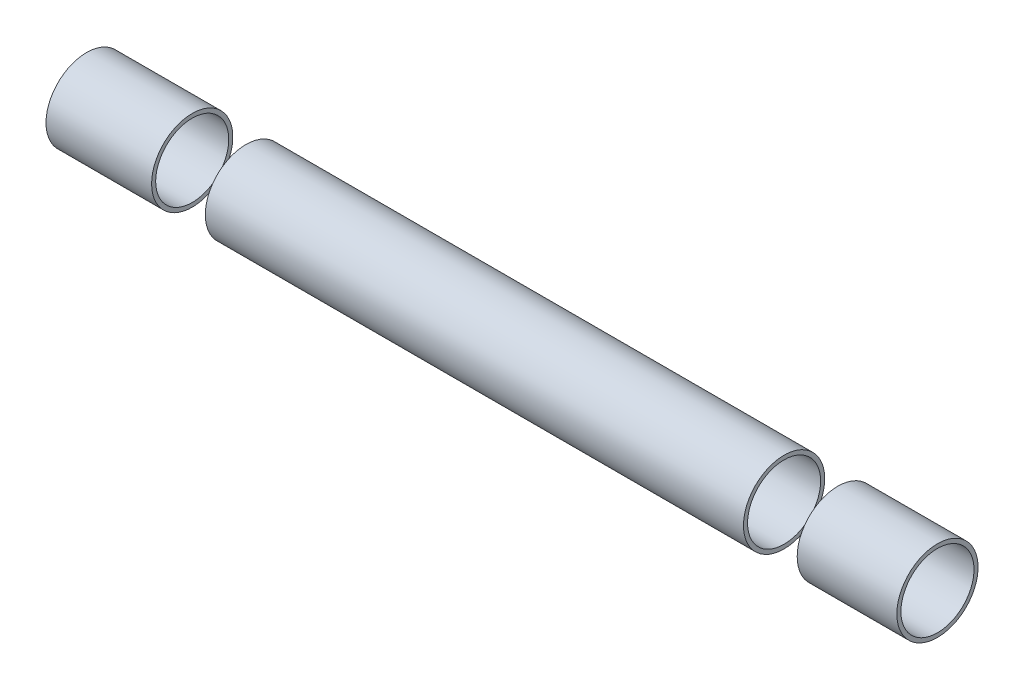
ISO-10303-21;
HEADER;
FILE_DESCRIPTION(('STEP AP214'),'2;1');
FILE_NAME('part.step','',(''),(''),'','','');
FILE_SCHEMA(('AUTOMOTIVE_DESIGN { 1 0 10303 214 1 1 1 1 }'));
ENDSEC;
DATA;
#1=APPLICATION_CONTEXT('core data for automotive mechanical design processes');
#2=APPLICATION_PROTOCOL_DEFINITION('international standard','automotive_design',2000,#1);
#3=PRODUCT_CONTEXT('',#1,'mechanical');
#4=PRODUCT('Part','Part','',(#3));
#5=PRODUCT_RELATED_PRODUCT_CATEGORY('part','',(#4));
#6=PRODUCT_DEFINITION_FORMATION('','',#4);
#7=PRODUCT_DEFINITION_CONTEXT('part definition',#1,'design');
#8=PRODUCT_DEFINITION('design','',#6,#7);
#9=PRODUCT_DEFINITION_SHAPE('','',#8);
#10=(LENGTH_UNIT() NAMED_UNIT(*) SI_UNIT(.MILLI.,.METRE.));
#11=(NAMED_UNIT(*) PLANE_ANGLE_UNIT() SI_UNIT($,.RADIAN.));
#12=(NAMED_UNIT(*) SI_UNIT($,.STERADIAN.) SOLID_ANGLE_UNIT());
#13=UNCERTAINTY_MEASURE_WITH_UNIT(LENGTH_MEASURE(1.E-05),#10,'distance_accuracy_value','');
#14=(GEOMETRIC_REPRESENTATION_CONTEXT(3) GLOBAL_UNCERTAINTY_ASSIGNED_CONTEXT((#13)) GLOBAL_UNIT_ASSIGNED_CONTEXT((#10,
#11,#12)) REPRESENTATION_CONTEXT('',''));
#15=CARTESIAN_POINT('',(0.,0.,0.));
#16=DIRECTION('',(0.,0.,1.));
#17=DIRECTION('',(1.,0.,0.));
#18=AXIS2_PLACEMENT_3D('',#15,#16,#17);
#19=CARTESIAN_POINT('',(167.4495,0.,0.));
#20=DIRECTION('',(-1.,0.,0.));
#21=DIRECTION('',(0.,0.,1.));
#22=AXIS2_PLACEMENT_3D('',#19,#20,#21);
#23=CYLINDRICAL_SURFACE('',#22,14.2875);
#24=CARTESIAN_POINT('',(-105.17450009,0.,0.));
#25=DIRECTION('',(1.,0.,0.));
#26=DIRECTION('',(0.,1.,0.));
#27=AXIS2_PLACEMENT_3D('',#24,#25,#26);
#28=CIRCLE('',#27,14.2875);
#29=CARTESIAN_POINT('',(-105.17450009,14.2875,0.));
#30=VERTEX_POINT('',#29);
#31=EDGE_CURVE('E62',#30,#30,#28,.T.);
#32=ORIENTED_EDGE('',*,*,#31,.F.);
#33=EDGE_LOOP('',(#32));
#34=FACE_BOUND('',#33,.T.);
#35=CARTESIAN_POINT('',(105.17450009,0.,0.));
#36=DIRECTION('',(-1.,0.,0.));
#37=DIRECTION('',(0.,-1.,0.));
#38=AXIS2_PLACEMENT_3D('',#35,#36,#37);
#39=CIRCLE('',#38,14.2875);
#40=CARTESIAN_POINT('',(105.17450009,-14.2875,0.));
#41=VERTEX_POINT('',#40);
#42=EDGE_CURVE('E64',#41,#41,#39,.T.);
#43=ORIENTED_EDGE('',*,*,#42,.F.);
#44=EDGE_LOOP('',(#43));
#45=FACE_BOUND('',#44,.T.);
#46=ADVANCED_FACE('F52',(#34,#45),#23,.F.);
#47=CARTESIAN_POINT('',(105.17450009,-15.875,-15.875));
#48=DIRECTION('',(-1.,0.,0.));
#49=DIRECTION('',(0.,-1.,0.));
#50=AXIS2_PLACEMENT_3D('',#47,#48,#49);
#51=PLANE('',#50);
#52=ORIENTED_EDGE('',*,*,#42,.T.);
#53=EDGE_LOOP('',(#52));
#54=FACE_BOUND('',#53,.T.);
#55=CARTESIAN_POINT('',(105.17450009,0.,0.));
#56=DIRECTION('',(-1.,0.,0.));
#57=DIRECTION('',(0.,-1.,0.));
#58=AXIS2_PLACEMENT_3D('',#55,#56,#57);
#59=CIRCLE('',#58,15.875);
#60=CARTESIAN_POINT('',(105.17450009,-15.875,0.));
#61=VERTEX_POINT('',#60);
#62=EDGE_CURVE('E55',#61,#61,#59,.T.);
#63=ORIENTED_EDGE('',*,*,#62,.F.);
#64=EDGE_LOOP('',(#63));
#65=FACE_BOUND('',#64,.T.);
#66=ADVANCED_FACE('F75',(#54,#65),#51,.F.);
#67=CARTESIAN_POINT('',(-105.17450009,-15.875,-15.875));
#68=DIRECTION('',(1.,0.,0.));
#69=DIRECTION('',(0.,1.,0.));
#70=AXIS2_PLACEMENT_3D('',#67,#68,#69);
#71=PLANE('',#70);
#72=ORIENTED_EDGE('',*,*,#31,.T.);
#73=EDGE_LOOP('',(#72));
#74=FACE_BOUND('',#73,.T.);
#75=CARTESIAN_POINT('',(-105.17450009,0.,0.));
#76=DIRECTION('',(1.,0.,0.));
#77=DIRECTION('',(0.,1.,0.));
#78=AXIS2_PLACEMENT_3D('',#75,#76,#77);
#79=CIRCLE('',#78,15.875);
#80=CARTESIAN_POINT('',(-105.17450009,15.875,0.));
#81=VERTEX_POINT('',#80);
#82=EDGE_CURVE('E12',#81,#81,#79,.T.);
#83=ORIENTED_EDGE('',*,*,#82,.F.);
#84=EDGE_LOOP('',(#83));
#85=FACE_BOUND('',#84,.T.);
#86=ADVANCED_FACE('F70',(#74,#85),#71,.F.);
#87=CARTESIAN_POINT('',(167.4495,0.,0.));
#88=DIRECTION('',(-1.,0.,0.));
#89=DIRECTION('',(0.,0.,1.));
#90=AXIS2_PLACEMENT_3D('',#87,#88,#89);
#91=CYLINDRICAL_SURFACE('',#90,15.875);
#92=ORIENTED_EDGE('',*,*,#62,.T.);
#93=EDGE_LOOP('',(#92));
#94=FACE_BOUND('',#93,.T.);
#95=ORIENTED_EDGE('',*,*,#82,.T.);
#96=EDGE_LOOP('',(#95));
#97=FACE_BOUND('',#96,.T.);
#98=ADVANCED_FACE('F83',(#94,#97),#91,.T.);
#99=CLOSED_SHELL('',(#46,#66,#86,#98));
#100=MANIFOLD_SOLID_BREP('B2',#99);
#101=CARTESIAN_POINT('',(167.4495,0.,0.));
#102=DIRECTION('',(-1.,0.,0.));
#103=DIRECTION('',(0.,0.,1.));
#104=AXIS2_PLACEMENT_3D('',#101,#102,#103);
#105=CYLINDRICAL_SURFACE('',#104,14.2875);
#106=CARTESIAN_POINT('',(165.1254,0.,0.));
#107=DIRECTION('',(-1.,0.,0.));
#108=DIRECTION('',(0.,0.,1.));
#109=AXIS2_PLACEMENT_3D('',#106,#107,#108);
#110=CIRCLE('',#109,14.2875);
#111=CARTESIAN_POINT('',(165.1254,0.,14.2875));
#112=VERTEX_POINT('',#111);
#113=EDGE_CURVE('E140',#112,#112,#110,.T.);
#114=ORIENTED_EDGE('',*,*,#113,.F.);
#115=EDGE_LOOP('',(#114));
#116=FACE_BOUND('',#115,.T.);
#117=CARTESIAN_POINT('',(126.1745,0.,0.));
#118=DIRECTION('',(1.,0.,0.));
#119=DIRECTION('',(0.,0.,-1.));
#120=AXIS2_PLACEMENT_3D('',#117,#118,#119);
#121=CIRCLE('',#120,14.2875);
#122=CARTESIAN_POINT('',(126.1745,0.,-14.2875));
#123=VERTEX_POINT('',#122);
#124=EDGE_CURVE('E144',#123,#123,#121,.T.);
#125=ORIENTED_EDGE('',*,*,#124,.F.);
#126=EDGE_LOOP('',(#125));
#127=FACE_BOUND('',#126,.T.);
#128=ADVANCED_FACE('F129',(#116,#127),#105,.F.);
#129=CARTESIAN_POINT('',(126.1745,-15.875,-15.875));
#130=DIRECTION('',(1.,0.,0.));
#131=DIRECTION('',(0.,0.,-1.));
#132=AXIS2_PLACEMENT_3D('',#129,#130,#131);
#133=PLANE('',#132);
#134=ORIENTED_EDGE('',*,*,#124,.T.);
#135=EDGE_LOOP('',(#134));
#136=FACE_BOUND('',#135,.T.);
#137=CARTESIAN_POINT('',(126.1745,0.,0.));
#138=DIRECTION('',(1.,0.,0.));
#139=DIRECTION('',(0.,0.,-1.));
#140=AXIS2_PLACEMENT_3D('',#137,#138,#139);
#141=CIRCLE('',#140,15.875);
#142=CARTESIAN_POINT('',(126.1745,0.,-15.875));
#143=VERTEX_POINT('',#142);
#144=EDGE_CURVE('E51',#143,#143,#141,.T.);
#145=ORIENTED_EDGE('',*,*,#144,.F.);
#146=EDGE_LOOP('',(#145));
#147=FACE_BOUND('',#146,.T.);
#148=ADVANCED_FACE('F150',(#136,#147),#133,.F.);
#149=CARTESIAN_POINT('',(165.1254,-15.875,-15.875));
#150=DIRECTION('',(-1.,0.,0.));
#151=DIRECTION('',(0.,0.,1.));
#152=AXIS2_PLACEMENT_3D('',#149,#150,#151);
#153=PLANE('',#152);
#154=ORIENTED_EDGE('',*,*,#113,.T.);
#155=EDGE_LOOP('',(#154));
#156=FACE_BOUND('',#155,.T.);
#157=CARTESIAN_POINT('',(165.1254,0.,0.));
#158=DIRECTION('',(-1.,0.,0.));
#159=DIRECTION('',(0.,0.,1.));
#160=AXIS2_PLACEMENT_3D('',#157,#158,#159);
#161=CIRCLE('',#160,15.875);
#162=CARTESIAN_POINT('',(165.1254,0.,15.875));
#163=VERTEX_POINT('',#162);
#164=EDGE_CURVE('E136',#163,#163,#161,.T.);
#165=ORIENTED_EDGE('',*,*,#164,.F.);
#166=EDGE_LOOP('',(#165));
#167=FACE_BOUND('',#166,.T.);
#168=ADVANCED_FACE('F158',(#156,#167),#153,.F.);
#169=CARTESIAN_POINT('',(167.4495,0.,0.));
#170=DIRECTION('',(-1.,0.,0.));
#171=DIRECTION('',(0.,0.,1.));
#172=AXIS2_PLACEMENT_3D('',#169,#170,#171);
#173=CYLINDRICAL_SURFACE('',#172,15.875);
#174=ORIENTED_EDGE('',*,*,#164,.T.);
#175=EDGE_LOOP('',(#174));
#176=FACE_BOUND('',#175,.T.);
#177=ORIENTED_EDGE('',*,*,#144,.T.);
#178=EDGE_LOOP('',(#177));
#179=FACE_BOUND('',#178,.T.);
#180=ADVANCED_FACE('F131',(#176,#179),#173,.T.);
#181=CLOSED_SHELL('',(#128,#148,#168,#180));
#182=MANIFOLD_SOLID_BREP('B7',#181);
#183=CARTESIAN_POINT('',(167.4495,0.,0.));
#184=DIRECTION('',(-1.,0.,0.));
#185=DIRECTION('',(0.,0.,1.));
#186=AXIS2_PLACEMENT_3D('',#183,#184,#185);
#187=CYLINDRICAL_SURFACE('',#186,15.875);
#188=CARTESIAN_POINT('',(-126.1745,0.,0.));
#189=DIRECTION('',(-1.,0.,0.));
#190=DIRECTION('',(0.,0.,1.));
#191=AXIS2_PLACEMENT_3D('',#188,#189,#190);
#192=CIRCLE('',#191,15.875);
#193=CARTESIAN_POINT('',(-126.1745,0.,15.875));
#194=VERTEX_POINT('',#193);
#195=EDGE_CURVE('E210',#194,#194,#192,.T.);
#196=ORIENTED_EDGE('',*,*,#195,.T.);
#197=EDGE_LOOP('',(#196));
#198=FACE_BOUND('',#197,.T.);
#199=CARTESIAN_POINT('',(-167.4495,0.,0.));
#200=DIRECTION('',(1.,0.,0.));
#201=DIRECTION('',(0.,0.,-1.));
#202=AXIS2_PLACEMENT_3D('',#199,#200,#201);
#203=CIRCLE('',#202,15.875);
#204=CARTESIAN_POINT('',(-167.4495,0.,-15.875));
#205=VERTEX_POINT('',#204);
#206=EDGE_CURVE('E128',#205,#205,#203,.T.);
#207=ORIENTED_EDGE('',*,*,#206,.T.);
#208=EDGE_LOOP('',(#207));
#209=FACE_BOUND('',#208,.T.);
#210=ADVANCED_FACE('F199',(#198,#209),#187,.T.);
#211=CARTESIAN_POINT('',(-167.4495,0.,0.));
#212=DIRECTION('',(1.,0.,0.));
#213=DIRECTION('',(0.,0.,-1.));
#214=AXIS2_PLACEMENT_3D('',#211,#212,#213);
#215=PLANE('',#214);
#216=ORIENTED_EDGE('',*,*,#206,.F.);
#217=EDGE_LOOP('',(#216));
#218=FACE_BOUND('',#217,.T.);
#219=CARTESIAN_POINT('',(-167.4495,0.,0.));
#220=DIRECTION('',(1.,0.,0.));
#221=DIRECTION('',(0.,0.,-1.));
#222=AXIS2_PLACEMENT_3D('',#219,#220,#221);
#223=CIRCLE('',#222,14.2875);
#224=CARTESIAN_POINT('',(-167.4495,0.,-14.2875));
#225=VERTEX_POINT('',#224);
#226=EDGE_CURVE('E206',#225,#225,#223,.T.);
#227=ORIENTED_EDGE('',*,*,#226,.T.);
#228=EDGE_LOOP('',(#227));
#229=FACE_BOUND('',#228,.T.);
#230=ADVANCED_FACE('F225',(#218,#229),#215,.F.);
#231=CARTESIAN_POINT('',(167.4495,0.,0.));
#232=DIRECTION('',(-1.,0.,0.));
#233=DIRECTION('',(0.,0.,1.));
#234=AXIS2_PLACEMENT_3D('',#231,#232,#233);
#235=CYLINDRICAL_SURFACE('',#234,14.2875);
#236=CARTESIAN_POINT('',(-126.1745,0.,0.));
#237=DIRECTION('',(-1.,0.,0.));
#238=DIRECTION('',(0.,0.,1.));
#239=AXIS2_PLACEMENT_3D('',#236,#237,#238);
#240=CIRCLE('',#239,14.2875);
#241=CARTESIAN_POINT('',(-126.1745,0.,14.2875));
#242=VERTEX_POINT('',#241);
#243=EDGE_CURVE('E202',#242,#242,#240,.T.);
#244=ORIENTED_EDGE('',*,*,#243,.F.);
#245=EDGE_LOOP('',(#244));
#246=FACE_BOUND('',#245,.T.);
#247=ORIENTED_EDGE('',*,*,#226,.F.);
#248=EDGE_LOOP('',(#247));
#249=FACE_BOUND('',#248,.T.);
#250=ADVANCED_FACE('F222',(#246,#249),#235,.F.);
#251=CARTESIAN_POINT('',(-126.1745,-15.875,-15.875));
#252=DIRECTION('',(-1.,0.,0.));
#253=DIRECTION('',(0.,0.,1.));
#254=AXIS2_PLACEMENT_3D('',#251,#252,#253);
#255=PLANE('',#254);
#256=ORIENTED_EDGE('',*,*,#243,.T.);
#257=EDGE_LOOP('',(#256));
#258=FACE_BOUND('',#257,.T.);
#259=ORIENTED_EDGE('',*,*,#195,.F.);
#260=EDGE_LOOP('',(#259));
#261=FACE_BOUND('',#260,.T.);
#262=ADVANCED_FACE('F219',(#258,#261),#255,.F.);
#263=CLOSED_SHELL('',(#210,#230,#250,#262));
#264=MANIFOLD_SOLID_BREP('B46',#263);
#265=ADVANCED_BREP_SHAPE_REPRESENTATION('',(#18,#100,#182,#264),#14);
#266=SHAPE_DEFINITION_REPRESENTATION(#9,#265);
ENDSEC;
END-ISO-10303-21;
